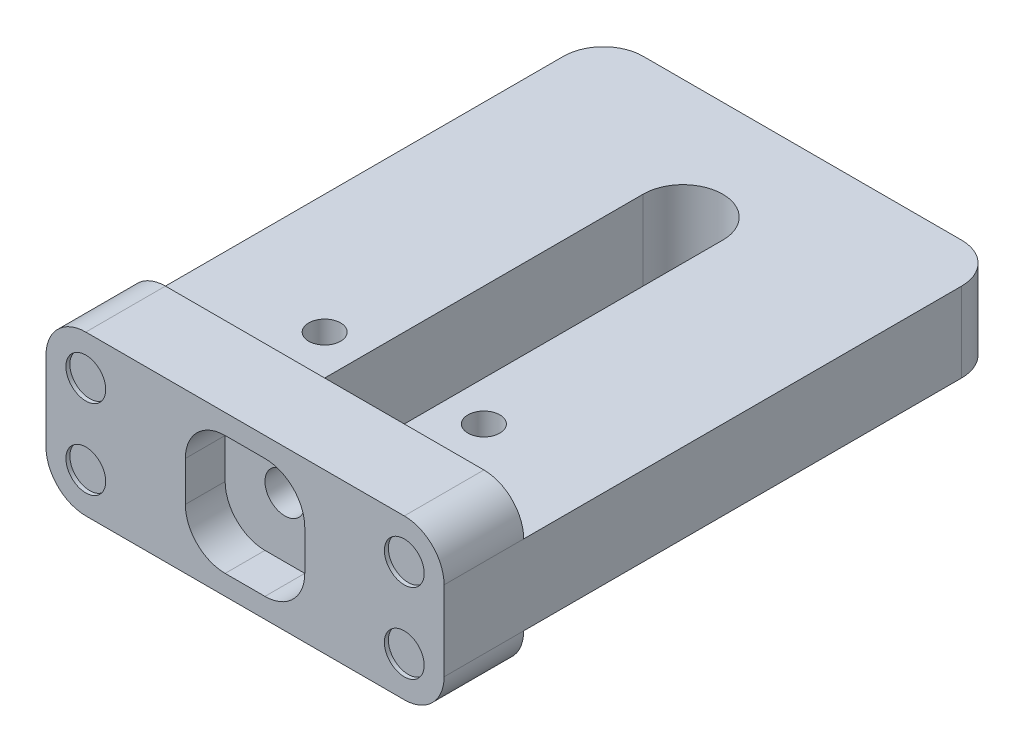
ISO-10303-21;
HEADER;
FILE_DESCRIPTION(('STEP AP214'),'2;1');
FILE_NAME('part.step','',(''),(''),'','','');
FILE_SCHEMA(('AUTOMOTIVE_DESIGN { 1 0 10303 214 1 1 1 1 }'));
ENDSEC;
DATA;
#1=APPLICATION_CONTEXT('core data for automotive mechanical design processes');
#2=APPLICATION_PROTOCOL_DEFINITION('international standard','automotive_design',2000,#1);
#3=PRODUCT_CONTEXT('',#1,'mechanical');
#4=PRODUCT('Part','Part','',(#3));
#5=PRODUCT_RELATED_PRODUCT_CATEGORY('part','',(#4));
#6=PRODUCT_DEFINITION_FORMATION('','',#4);
#7=PRODUCT_DEFINITION_CONTEXT('part definition',#1,'design');
#8=PRODUCT_DEFINITION('design','',#6,#7);
#9=PRODUCT_DEFINITION_SHAPE('','',#8);
#10=(LENGTH_UNIT() NAMED_UNIT(*) SI_UNIT(.MILLI.,.METRE.));
#11=(NAMED_UNIT(*) PLANE_ANGLE_UNIT() SI_UNIT($,.RADIAN.));
#12=(NAMED_UNIT(*) SI_UNIT($,.STERADIAN.) SOLID_ANGLE_UNIT());
#13=UNCERTAINTY_MEASURE_WITH_UNIT(LENGTH_MEASURE(1.E-05),#10,'distance_accuracy_value','');
#14=(GEOMETRIC_REPRESENTATION_CONTEXT(3) GLOBAL_UNCERTAINTY_ASSIGNED_CONTEXT((#13)) GLOBAL_UNIT_ASSIGNED_CONTEXT((#10,
#11,#12)) REPRESENTATION_CONTEXT('',''));
#15=CARTESIAN_POINT('',(0.,0.,0.));
#16=DIRECTION('',(0.,0.,1.));
#17=DIRECTION('',(1.,0.,0.));
#18=AXIS2_PLACEMENT_3D('',#15,#16,#17);
#19=CARTESIAN_POINT('',(0.,0.,-30.));
#20=DIRECTION('',(0.,1.,0.));
#21=DIRECTION('',(0.,0.,1.));
#22=AXIS2_PLACEMENT_3D('',#19,#20,#21);
#23=CYLINDRICAL_SURFACE('',#22,9.99999999999999);
#24=DIRECTION('',(0.,1.,0.));
#25=VECTOR('',#24,1.);
#26=CARTESIAN_POINT('',(-10.,-10.,-30.));
#27=LINE('',#26,#25);
#28=CARTESIAN_POINT('',(-10.,0.,-30.));
#29=VERTEX_POINT('',#28);
#30=CARTESIAN_POINT('',(-10.,20.,-29.9999999999999));
#31=VERTEX_POINT('',#30);
#32=EDGE_CURVE('E335',#29,#31,#27,.T.);
#33=ORIENTED_EDGE('',*,*,#32,.F.);
#34=CARTESIAN_POINT('',(0.,0.,-30.));
#35=DIRECTION('',(0.,-1.,0.));
#36=DIRECTION('',(0.,0.,-1.));
#37=AXIS2_PLACEMENT_3D('',#34,#35,#36);
#38=CIRCLE('',#37,9.99999999999999);
#39=CARTESIAN_POINT('',(10.,0.,-30.));
#40=VERTEX_POINT('',#39);
#41=EDGE_CURVE('E45',#29,#40,#38,.T.);
#42=ORIENTED_EDGE('',*,*,#41,.T.);
#43=DIRECTION('',(0.,1.,0.));
#44=VECTOR('',#43,1.);
#45=CARTESIAN_POINT('',(10.,-10.,-30.));
#46=LINE('',#45,#44);
#47=CARTESIAN_POINT('',(10.,20.,-29.9999999999999));
#48=VERTEX_POINT('',#47);
#49=EDGE_CURVE('E338',#48,#40,#46,.F.);
#50=ORIENTED_EDGE('',*,*,#49,.F.);
#51=CARTESIAN_POINT('',(0.,20.,-30.));
#52=DIRECTION('',(0.,-1.,0.));
#53=DIRECTION('',(0.,0.,-1.));
#54=AXIS2_PLACEMENT_3D('',#51,#52,#53);
#55=CIRCLE('',#54,9.99999999999999);
#56=EDGE_CURVE('E12',#48,#31,#55,.F.);
#57=ORIENTED_EDGE('',*,*,#56,.T.);
#58=EDGE_LOOP('',(#33,#42,#50,#57));
#59=FACE_BOUND('',#58,.T.);
#60=ADVANCED_FACE('F37',(#59),#23,.F.);
#61=CARTESIAN_POINT('',(0.,20.,0.));
#62=DIRECTION('',(0.,-1.,0.));
#63=DIRECTION('',(0.,0.,-1.));
#64=AXIS2_PLACEMENT_3D('',#61,#62,#63);
#65=PLANE('',#64);
#66=DIRECTION('',(0.,0.,-1.));
#67=VECTOR('',#66,1.);
#68=CARTESIAN_POINT('',(50.,20.,60.));
#69=LINE('',#68,#67);
#70=CARTESIAN_POINT('',(50.,20.,60.));
#71=VERTEX_POINT('',#70);
#72=CARTESIAN_POINT('',(50.,20.,-50.));
#73=VERTEX_POINT('',#72);
#74=EDGE_CURVE('E244',#71,#73,#69,.T.);
#75=ORIENTED_EDGE('',*,*,#74,.T.);
#76=CARTESIAN_POINT('',(40.,20.,-50.));
#77=DIRECTION('',(0.,-1.,0.));
#78=DIRECTION('',(0.,0.,-1.));
#79=AXIS2_PLACEMENT_3D('',#76,#77,#78);
#80=CIRCLE('',#79,10.);
#81=CARTESIAN_POINT('',(40.,20.,-60.));
#82=VERTEX_POINT('',#81);
#83=EDGE_CURVE('E295',#73,#82,#80,.F.);
#84=ORIENTED_EDGE('',*,*,#83,.T.);
#85=DIRECTION('',(-1.,0.,0.));
#86=VECTOR('',#85,1.);
#87=CARTESIAN_POINT('',(-50.,20.,-60.));
#88=LINE('',#87,#86);
#89=CARTESIAN_POINT('',(-40.,20.,-60.));
#90=VERTEX_POINT('',#89);
#91=EDGE_CURVE('E226',#82,#90,#88,.T.);
#92=ORIENTED_EDGE('',*,*,#91,.T.);
#93=CARTESIAN_POINT('',(-40.,20.,-50.));
#94=DIRECTION('',(0.,-1.,0.));
#95=DIRECTION('',(0.,0.,-1.));
#96=AXIS2_PLACEMENT_3D('',#93,#94,#95);
#97=CIRCLE('',#96,10.);
#98=CARTESIAN_POINT('',(-50.,20.,-50.));
#99=VERTEX_POINT('',#98);
#100=EDGE_CURVE('E293',#90,#99,#97,.F.);
#101=ORIENTED_EDGE('',*,*,#100,.T.);
#102=DIRECTION('',(0.,0.,1.));
#103=VECTOR('',#102,1.);
#104=CARTESIAN_POINT('',(-50.,20.,60.));
#105=LINE('',#104,#103);
#106=CARTESIAN_POINT('',(-50.,20.,60.));
#107=VERTEX_POINT('',#106);
#108=EDGE_CURVE('E221',#99,#107,#105,.T.);
#109=ORIENTED_EDGE('',*,*,#108,.T.);
#110=DIRECTION('',(1.,0.,0.));
#111=VECTOR('',#110,1.);
#112=CARTESIAN_POINT('',(-50.,20.,60.));
#113=LINE('',#112,#111);
#114=CARTESIAN_POINT('',(-10.,20.,60.));
#115=VERTEX_POINT('',#114);
#116=EDGE_CURVE('E220',#107,#115,#113,.T.);
#117=ORIENTED_EDGE('',*,*,#116,.T.);
#118=DIRECTION('',(0.,0.,1.));
#119=VECTOR('',#118,1.);
#120=CARTESIAN_POINT('',(-10.,20.,60.));
#121=LINE('',#120,#119);
#122=EDGE_CURVE('E214',#31,#115,#121,.T.);
#123=ORIENTED_EDGE('',*,*,#122,.F.);
#124=ORIENTED_EDGE('',*,*,#56,.F.);
#125=DIRECTION('',(0.,0.,-1.));
#126=VECTOR('',#125,1.);
#127=CARTESIAN_POINT('',(10.,20.,60.));
#128=LINE('',#127,#126);
#129=CARTESIAN_POINT('',(10.,20.,60.));
#130=VERTEX_POINT('',#129);
#131=EDGE_CURVE('E198',#130,#48,#128,.T.);
#132=ORIENTED_EDGE('',*,*,#131,.F.);
#133=EDGE_CURVE('E212',#130,#71,#113,.T.);
#134=ORIENTED_EDGE('',*,*,#133,.T.);
#135=EDGE_LOOP('',(#75,#84,#92,#101,#109,#117,#123,#124,#132,#134));
#136=FACE_BOUND('',#135,.T.);
#137=CARTESIAN_POINT('',(-20.,20.,40.));
#138=DIRECTION('',(0.,1.,0.));
#139=DIRECTION('',(0.,0.,1.));
#140=AXIS2_PLACEMENT_3D('',#137,#138,#139);
#141=CIRCLE('',#140,4.);
#142=CARTESIAN_POINT('',(-20.,20.,44.));
#143=VERTEX_POINT('',#142);
#144=EDGE_CURVE('E234',#143,#143,#141,.T.);
#145=ORIENTED_EDGE('',*,*,#144,.F.);
#146=EDGE_LOOP('',(#145));
#147=FACE_BOUND('',#146,.T.);
#148=CARTESIAN_POINT('',(20.,20.,40.));
#149=DIRECTION('',(0.,1.,0.));
#150=DIRECTION('',(0.,0.,1.));
#151=AXIS2_PLACEMENT_3D('',#148,#149,#150);
#152=CIRCLE('',#151,4.);
#153=CARTESIAN_POINT('',(20.,20.,44.));
#154=VERTEX_POINT('',#153);
#155=EDGE_CURVE('E421',#154,#154,#152,.T.);
#156=ORIENTED_EDGE('',*,*,#155,.F.);
#157=EDGE_LOOP('',(#156));
#158=FACE_BOUND('',#157,.T.);
#159=ADVANCED_FACE('F210',(#136,#147,#158),#65,.F.);
#160=CARTESIAN_POINT('',(0.,0.,0.));
#161=DIRECTION('',(0.,-1.,0.));
#162=DIRECTION('',(0.,0.,-1.));
#163=AXIS2_PLACEMENT_3D('',#160,#161,#162);
#164=PLANE('',#163);
#165=DIRECTION('',(-1.,0.,0.));
#166=VECTOR('',#165,1.);
#167=CARTESIAN_POINT('',(-50.,0.,-60.));
#168=LINE('',#167,#166);
#169=CARTESIAN_POINT('',(40.,0.,-60.));
#170=VERTEX_POINT('',#169);
#171=CARTESIAN_POINT('',(-40.,0.,-60.));
#172=VERTEX_POINT('',#171);
#173=EDGE_CURVE('E233',#170,#172,#168,.T.);
#174=ORIENTED_EDGE('',*,*,#173,.F.);
#175=CARTESIAN_POINT('',(40.,0.,-50.));
#176=DIRECTION('',(0.,-1.,0.));
#177=DIRECTION('',(0.,0.,-1.));
#178=AXIS2_PLACEMENT_3D('',#175,#176,#177);
#179=CIRCLE('',#178,10.);
#180=CARTESIAN_POINT('',(50.,0.,-50.));
#181=VERTEX_POINT('',#180);
#182=EDGE_CURVE('E289',#170,#181,#179,.T.);
#183=ORIENTED_EDGE('',*,*,#182,.T.);
#184=DIRECTION('',(0.,0.,-1.));
#185=VECTOR('',#184,1.);
#186=CARTESIAN_POINT('',(50.,0.,60.));
#187=LINE('',#186,#185);
#188=CARTESIAN_POINT('',(50.,0.,60.));
#189=VERTEX_POINT('',#188);
#190=EDGE_CURVE('E230',#189,#181,#187,.T.);
#191=ORIENTED_EDGE('',*,*,#190,.F.);
#192=DIRECTION('',(1.,0.,0.));
#193=VECTOR('',#192,1.);
#194=CARTESIAN_POINT('',(-50.,0.,60.));
#195=LINE('',#194,#193);
#196=CARTESIAN_POINT('',(10.,0.,60.));
#197=VERTEX_POINT('',#196);
#198=EDGE_CURVE('E240',#197,#189,#195,.T.);
#199=ORIENTED_EDGE('',*,*,#198,.F.);
#200=DIRECTION('',(0.,0.,1.));
#201=VECTOR('',#200,1.);
#202=CARTESIAN_POINT('',(10.,0.,0.));
#203=LINE('',#202,#201);
#204=EDGE_CURVE('E200',#40,#197,#203,.T.);
#205=ORIENTED_EDGE('',*,*,#204,.F.);
#206=ORIENTED_EDGE('',*,*,#41,.F.);
#207=DIRECTION('',(0.,0.,-1.));
#208=VECTOR('',#207,1.);
#209=CARTESIAN_POINT('',(-10.,0.,0.));
#210=LINE('',#209,#208);
#211=CARTESIAN_POINT('',(-10.,0.,60.));
#212=VERTEX_POINT('',#211);
#213=EDGE_CURVE('E345',#212,#29,#210,.T.);
#214=ORIENTED_EDGE('',*,*,#213,.F.);
#215=CARTESIAN_POINT('',(-50.,0.,60.));
#216=VERTEX_POINT('',#215);
#217=EDGE_CURVE('E241',#216,#212,#195,.T.);
#218=ORIENTED_EDGE('',*,*,#217,.F.);
#219=DIRECTION('',(0.,0.,1.));
#220=VECTOR('',#219,1.);
#221=CARTESIAN_POINT('',(-50.,0.,60.));
#222=LINE('',#221,#220);
#223=CARTESIAN_POINT('',(-50.,0.,-50.));
#224=VERTEX_POINT('',#223);
#225=EDGE_CURVE('E237',#224,#216,#222,.T.);
#226=ORIENTED_EDGE('',*,*,#225,.F.);
#227=CARTESIAN_POINT('',(-40.,0.,-50.));
#228=DIRECTION('',(0.,-1.,0.));
#229=DIRECTION('',(0.,0.,-1.));
#230=AXIS2_PLACEMENT_3D('',#227,#228,#229);
#231=CIRCLE('',#230,10.);
#232=EDGE_CURVE('E287',#224,#172,#231,.T.);
#233=ORIENTED_EDGE('',*,*,#232,.T.);
#234=EDGE_LOOP('',(#174,#183,#191,#199,#205,#206,#214,#218,#226,#233));
#235=FACE_BOUND('',#234,.T.);
#236=CARTESIAN_POINT('',(-20.,0.,40.));
#237=DIRECTION('',(0.,1.,0.));
#238=DIRECTION('',(0.,0.,1.));
#239=AXIS2_PLACEMENT_3D('',#236,#237,#238);
#240=CIRCLE('',#239,4.);
#241=CARTESIAN_POINT('',(-20.,0.,44.));
#242=VERTEX_POINT('',#241);
#243=EDGE_CURVE('E424',#242,#242,#240,.T.);
#244=ORIENTED_EDGE('',*,*,#243,.T.);
#245=EDGE_LOOP('',(#244));
#246=FACE_BOUND('',#245,.T.);
#247=CARTESIAN_POINT('',(20.,0.,40.));
#248=DIRECTION('',(0.,1.,0.));
#249=DIRECTION('',(0.,0.,1.));
#250=AXIS2_PLACEMENT_3D('',#247,#248,#249);
#251=CIRCLE('',#250,4.);
#252=CARTESIAN_POINT('',(20.,0.,44.));
#253=VERTEX_POINT('',#252);
#254=EDGE_CURVE('E416',#253,#253,#251,.T.);
#255=ORIENTED_EDGE('',*,*,#254,.T.);
#256=EDGE_LOOP('',(#255));
#257=FACE_BOUND('',#256,.T.);
#258=ADVANCED_FACE('F341',(#235,#246,#257),#164,.T.);
#259=CARTESIAN_POINT('',(50.,20.,60.));
#260=DIRECTION('',(-1.,0.,0.));
#261=DIRECTION('',(0.,0.,1.));
#262=AXIS2_PLACEMENT_3D('',#259,#260,#261);
#263=PLANE('',#262);
#264=ORIENTED_EDGE('',*,*,#74,.F.);
#265=DIRECTION('',(0.,0.,-1.));
#266=VECTOR('',#265,1.);
#267=CARTESIAN_POINT('',(50.,20.,60.));
#268=LINE('',#267,#266);
#269=CARTESIAN_POINT('',(50.,20.,80.));
#270=VERTEX_POINT('',#269);
#271=EDGE_CURVE('E315',#71,#270,#268,.F.);
#272=ORIENTED_EDGE('',*,*,#271,.T.);
#273=DIRECTION('',(0.,1.,0.));
#274=VECTOR('',#273,1.);
#275=CARTESIAN_POINT('',(50.,-10.,80.));
#276=LINE('',#275,#274);
#277=CARTESIAN_POINT('',(50.,0.,80.));
#278=VERTEX_POINT('',#277);
#279=EDGE_CURVE('E410',#278,#270,#276,.T.);
#280=ORIENTED_EDGE('',*,*,#279,.F.);
#281=DIRECTION('',(0.,0.,-1.));
#282=VECTOR('',#281,1.);
#283=CARTESIAN_POINT('',(50.,0.,60.));
#284=LINE('',#283,#282);
#285=EDGE_CURVE('E312',#278,#189,#284,.T.);
#286=ORIENTED_EDGE('',*,*,#285,.T.);
#287=ORIENTED_EDGE('',*,*,#190,.T.);
#288=DIRECTION('',(0.,-1.,0.));
#289=VECTOR('',#288,1.);
#290=CARTESIAN_POINT('',(50.,20.,-50.));
#291=LINE('',#290,#289);
#292=EDGE_CURVE('E291',#181,#73,#291,.F.);
#293=ORIENTED_EDGE('',*,*,#292,.T.);
#294=EDGE_LOOP('',(#264,#272,#280,#286,#287,#293));
#295=FACE_BOUND('',#294,.T.);
#296=ADVANCED_FACE('F474',(#295),#263,.F.);
#297=CARTESIAN_POINT('',(-50.,20.,-60.));
#298=DIRECTION('',(0.,0.,1.));
#299=DIRECTION('',(1.,0.,0.));
#300=AXIS2_PLACEMENT_3D('',#297,#298,#299);
#301=PLANE('',#300);
#302=ORIENTED_EDGE('',*,*,#91,.F.);
#303=DIRECTION('',(0.,-1.,0.));
#304=VECTOR('',#303,1.);
#305=CARTESIAN_POINT('',(40.,20.,-60.));
#306=LINE('',#305,#304);
#307=EDGE_CURVE('E284',#82,#170,#306,.T.);
#308=ORIENTED_EDGE('',*,*,#307,.T.);
#309=ORIENTED_EDGE('',*,*,#173,.T.);
#310=DIRECTION('',(0.,-1.,0.));
#311=VECTOR('',#310,1.);
#312=CARTESIAN_POINT('',(-40.,20.,-60.));
#313=LINE('',#312,#311);
#314=EDGE_CURVE('E282',#172,#90,#313,.F.);
#315=ORIENTED_EDGE('',*,*,#314,.T.);
#316=EDGE_LOOP('',(#302,#308,#309,#315));
#317=FACE_BOUND('',#316,.T.);
#318=ADVANCED_FACE('F482',(#317),#301,.F.);
#319=CARTESIAN_POINT('',(-50.,20.,60.));
#320=DIRECTION('',(1.,0.,0.));
#321=DIRECTION('',(0.,0.,-1.));
#322=AXIS2_PLACEMENT_3D('',#319,#320,#321);
#323=PLANE('',#322);
#324=ORIENTED_EDGE('',*,*,#225,.T.);
#325=DIRECTION('',(0.,0.,-1.));
#326=VECTOR('',#325,1.);
#327=CARTESIAN_POINT('',(-50.,0.,60.));
#328=LINE('',#327,#326);
#329=CARTESIAN_POINT('',(-50.,0.,80.));
#330=VERTEX_POINT('',#329);
#331=EDGE_CURVE('E333',#216,#330,#328,.F.);
#332=ORIENTED_EDGE('',*,*,#331,.T.);
#333=DIRECTION('',(0.,-1.,0.));
#334=VECTOR('',#333,1.);
#335=CARTESIAN_POINT('',(-50.,-10.,80.));
#336=LINE('',#335,#334);
#337=CARTESIAN_POINT('',(-50.,20.,80.));
#338=VERTEX_POINT('',#337);
#339=EDGE_CURVE('E403',#338,#330,#336,.T.);
#340=ORIENTED_EDGE('',*,*,#339,.F.);
#341=DIRECTION('',(0.,0.,-1.));
#342=VECTOR('',#341,1.);
#343=CARTESIAN_POINT('',(-50.,20.,60.));
#344=LINE('',#343,#342);
#345=EDGE_CURVE('E330',#338,#107,#344,.T.);
#346=ORIENTED_EDGE('',*,*,#345,.T.);
#347=ORIENTED_EDGE('',*,*,#108,.F.);
#348=DIRECTION('',(0.,-1.,0.));
#349=VECTOR('',#348,1.);
#350=CARTESIAN_POINT('',(-50.,20.,-50.));
#351=LINE('',#350,#349);
#352=EDGE_CURVE('E297',#99,#224,#351,.T.);
#353=ORIENTED_EDGE('',*,*,#352,.T.);
#354=EDGE_LOOP('',(#324,#332,#340,#346,#347,#353));
#355=FACE_BOUND('',#354,.T.);
#356=ADVANCED_FACE('F444',(#355),#323,.F.);
#357=CARTESIAN_POINT('',(-20.,20.,40.));
#358=DIRECTION('',(0.,-1.,0.));
#359=DIRECTION('',(0.,0.,-1.));
#360=AXIS2_PLACEMENT_3D('',#357,#358,#359);
#361=CYLINDRICAL_SURFACE('',#360,4.);
#362=ORIENTED_EDGE('',*,*,#144,.T.);
#363=EDGE_LOOP('',(#362));
#364=FACE_BOUND('',#363,.T.);
#365=ORIENTED_EDGE('',*,*,#243,.F.);
#366=EDGE_LOOP('',(#365));
#367=FACE_BOUND('',#366,.T.);
#368=ADVANCED_FACE('F477',(#364,#367),#361,.F.);
#369=CARTESIAN_POINT('',(20.,20.,40.));
#370=DIRECTION('',(0.,-1.,0.));
#371=DIRECTION('',(0.,0.,-1.));
#372=AXIS2_PLACEMENT_3D('',#369,#370,#371);
#373=CYLINDRICAL_SURFACE('',#372,4.);
#374=ORIENTED_EDGE('',*,*,#155,.T.);
#375=EDGE_LOOP('',(#374));
#376=FACE_BOUND('',#375,.T.);
#377=ORIENTED_EDGE('',*,*,#254,.F.);
#378=EDGE_LOOP('',(#377));
#379=FACE_BOUND('',#378,.T.);
#380=ADVANCED_FACE('F715',(#376,#379),#373,.F.);
#381=CARTESIAN_POINT('',(0.,0.,60.));
#382=DIRECTION('',(0.,0.,-1.));
#383=DIRECTION('',(-1.,0.,0.));
#384=AXIS2_PLACEMENT_3D('',#381,#382,#383);
#385=PLANE('',#384);
#386=DIRECTION('',(-1.,0.,0.));
#387=VECTOR('',#386,1.);
#388=CARTESIAN_POINT('',(-50.,30.,60.));
#389=LINE('',#388,#387);
#390=CARTESIAN_POINT('',(40.,30.,60.));
#391=VERTEX_POINT('',#390);
#392=CARTESIAN_POINT('',(-40.,30.,60.));
#393=VERTEX_POINT('',#392);
#394=EDGE_CURVE('E407',#391,#393,#389,.T.);
#395=ORIENTED_EDGE('',*,*,#394,.F.);
#396=CARTESIAN_POINT('',(40.,20.,60.));
#397=DIRECTION('',(0.,0.,-1.));
#398=DIRECTION('',(-1.,0.,0.));
#399=AXIS2_PLACEMENT_3D('',#396,#397,#398);
#400=CIRCLE('',#399,10.);
#401=EDGE_CURVE('E219',#391,#71,#400,.T.);
#402=ORIENTED_EDGE('',*,*,#401,.T.);
#403=ORIENTED_EDGE('',*,*,#133,.F.);
#404=DIRECTION('',(0.,1.,0.));
#405=VECTOR('',#404,1.);
#406=CARTESIAN_POINT('',(10.,-10.,60.));
#407=LINE('',#406,#405);
#408=EDGE_CURVE('E196',#197,#130,#407,.T.);
#409=ORIENTED_EDGE('',*,*,#408,.F.);
#410=ORIENTED_EDGE('',*,*,#198,.T.);
#411=CARTESIAN_POINT('',(40.,0.,60.));
#412=DIRECTION('',(0.,0.,-1.));
#413=DIRECTION('',(-1.,0.,0.));
#414=AXIS2_PLACEMENT_3D('',#411,#412,#413);
#415=CIRCLE('',#414,10.);
#416=CARTESIAN_POINT('',(40.,-10.,60.));
#417=VERTEX_POINT('',#416);
#418=EDGE_CURVE('E309',#189,#417,#415,.T.);
#419=ORIENTED_EDGE('',*,*,#418,.T.);
#420=DIRECTION('',(1.,0.,0.));
#421=VECTOR('',#420,1.);
#422=CARTESIAN_POINT('',(-50.,-10.,60.));
#423=LINE('',#422,#421);
#424=CARTESIAN_POINT('',(-40.,-10.,60.));
#425=VERTEX_POINT('',#424);
#426=EDGE_CURVE('E392',#425,#417,#423,.T.);
#427=ORIENTED_EDGE('',*,*,#426,.F.);
#428=CARTESIAN_POINT('',(-40.,0.,60.));
#429=DIRECTION('',(0.,0.,-1.));
#430=DIRECTION('',(-1.,0.,0.));
#431=AXIS2_PLACEMENT_3D('',#428,#429,#430);
#432=CIRCLE('',#431,10.);
#433=EDGE_CURVE('E307',#425,#216,#432,.T.);
#434=ORIENTED_EDGE('',*,*,#433,.T.);
#435=ORIENTED_EDGE('',*,*,#217,.T.);
#436=DIRECTION('',(0.,1.,0.));
#437=VECTOR('',#436,1.);
#438=CARTESIAN_POINT('',(-10.,-10.,60.));
#439=LINE('',#438,#437);
#440=EDGE_CURVE('E206',#212,#115,#439,.T.);
#441=ORIENTED_EDGE('',*,*,#440,.T.);
#442=ORIENTED_EDGE('',*,*,#116,.F.);
#443=CARTESIAN_POINT('',(-40.,20.,60.));
#444=DIRECTION('',(0.,0.,-1.));
#445=DIRECTION('',(-1.,0.,0.));
#446=AXIS2_PLACEMENT_3D('',#443,#444,#445);
#447=CIRCLE('',#446,10.);
#448=EDGE_CURVE('E305',#107,#393,#447,.T.);
#449=ORIENTED_EDGE('',*,*,#448,.T.);
#450=EDGE_LOOP('',(#395,#402,#403,#409,#410,#419,#427,#434,#435,#441,#442,#449));
#451=FACE_BOUND('',#450,.T.);
#452=CARTESIAN_POINT('',(0.,9.99999999999998,60.));
#453=DIRECTION('',(0.,0.,1.));
#454=DIRECTION('',(1.,0.,0.));
#455=AXIS2_PLACEMENT_3D('',#452,#453,#454);
#456=CIRCLE('',#455,5.);
#457=CARTESIAN_POINT('',(5.,9.99999999999998,60.));
#458=VERTEX_POINT('',#457);
#459=EDGE_CURVE('E205',#458,#458,#456,.F.);
#460=ORIENTED_EDGE('',*,*,#459,.F.);
#461=EDGE_LOOP('',(#460));
#462=FACE_BOUND('',#461,.T.);
#463=ADVANCED_FACE('F217',(#451,#462),#385,.T.);
#464=CARTESIAN_POINT('',(-50.,-10.,80.));
#465=DIRECTION('',(0.,1.,0.));
#466=DIRECTION('',(0.,0.,1.));
#467=AXIS2_PLACEMENT_3D('',#464,#465,#466);
#468=PLANE('',#467);
#469=ORIENTED_EDGE('',*,*,#426,.T.);
#470=DIRECTION('',(0.,0.,-1.));
#471=VECTOR('',#470,1.);
#472=CARTESIAN_POINT('',(40.,-10.,80.0000000000001));
#473=LINE('',#472,#471);
#474=CARTESIAN_POINT('',(40.,-10.,80.));
#475=VERTEX_POINT('',#474);
#476=EDGE_CURVE('E328',#417,#475,#473,.F.);
#477=ORIENTED_EDGE('',*,*,#476,.T.);
#478=DIRECTION('',(1.,0.,0.));
#479=VECTOR('',#478,1.);
#480=CARTESIAN_POINT('',(-50.,-10.,80.));
#481=LINE('',#480,#479);
#482=CARTESIAN_POINT('',(-40.,-10.,80.));
#483=VERTEX_POINT('',#482);
#484=EDGE_CURVE('E406',#483,#475,#481,.T.);
#485=ORIENTED_EDGE('',*,*,#484,.F.);
#486=DIRECTION('',(0.,0.,-1.));
#487=VECTOR('',#486,1.);
#488=CARTESIAN_POINT('',(-40.,-10.,80.));
#489=LINE('',#488,#487);
#490=EDGE_CURVE('E325',#483,#425,#489,.T.);
#491=ORIENTED_EDGE('',*,*,#490,.T.);
#492=EDGE_LOOP('',(#469,#477,#485,#491));
#493=FACE_BOUND('',#492,.T.);
#494=ADVANCED_FACE('F700',(#493),#468,.F.);
#495=CARTESIAN_POINT('',(-50.,30.,80.));
#496=DIRECTION('',(0.,-1.,0.));
#497=DIRECTION('',(1.,0.,0.));
#498=AXIS2_PLACEMENT_3D('',#495,#496,#497);
#499=PLANE('',#498);
#500=DIRECTION('',(-1.,0.,0.));
#501=VECTOR('',#500,1.);
#502=CARTESIAN_POINT('',(-50.,30.,80.));
#503=LINE('',#502,#501);
#504=CARTESIAN_POINT('',(39.9999999999999,30.,80.));
#505=VERTEX_POINT('',#504);
#506=CARTESIAN_POINT('',(-40.,30.,80.));
#507=VERTEX_POINT('',#506);
#508=EDGE_CURVE('E413',#505,#507,#503,.T.);
#509=ORIENTED_EDGE('',*,*,#508,.F.);
#510=DIRECTION('',(0.,0.,-1.));
#511=VECTOR('',#510,1.);
#512=CARTESIAN_POINT('',(39.9999999999999,30.,80.0000000000001));
#513=LINE('',#512,#511);
#514=EDGE_CURVE('E302',#505,#391,#513,.T.);
#515=ORIENTED_EDGE('',*,*,#514,.T.);
#516=ORIENTED_EDGE('',*,*,#394,.T.);
#517=DIRECTION('',(0.,0.,-1.));
#518=VECTOR('',#517,1.);
#519=CARTESIAN_POINT('',(-40.,30.,80.));
#520=LINE('',#519,#518);
#521=EDGE_CURVE('E300',#393,#507,#520,.F.);
#522=ORIENTED_EDGE('',*,*,#521,.T.);
#523=EDGE_LOOP('',(#509,#515,#516,#522));
#524=FACE_BOUND('',#523,.T.);
#525=ADVANCED_FACE('F692',(#524),#499,.F.);
#526=CARTESIAN_POINT('',(0.,0.,80.));
#527=DIRECTION('',(0.,0.,-1.));
#528=DIRECTION('',(-1.,0.,0.));
#529=AXIS2_PLACEMENT_3D('',#526,#527,#528);
#530=PLANE('',#529);
#531=CARTESIAN_POINT('',(-40.,0.,80.));
#532=DIRECTION('',(0.,0.,1.));
#533=DIRECTION('',(-1.,0.,0.));
#534=AXIS2_PLACEMENT_3D('',#531,#532,#533);
#535=CIRCLE('',#534,4.99999999999999);
#536=CARTESIAN_POINT('',(-45.,0.,80.));
#537=VERTEX_POINT('',#536);
#538=EDGE_CURVE('E348',#537,#537,#535,.T.);
#539=ORIENTED_EDGE('',*,*,#538,.F.);
#540=EDGE_LOOP('',(#539));
#541=FACE_BOUND('',#540,.T.);
#542=CARTESIAN_POINT('',(39.9999999999999,0.,80.));
#543=DIRECTION('',(0.,0.,1.));
#544=DIRECTION('',(1.,0.,0.));
#545=AXIS2_PLACEMENT_3D('',#542,#543,#544);
#546=CIRCLE('',#545,5.00000000000001);
#547=CARTESIAN_POINT('',(45.,0.,80.));
#548=VERTEX_POINT('',#547);
#549=EDGE_CURVE('E362',#548,#548,#546,.T.);
#550=ORIENTED_EDGE('',*,*,#549,.F.);
#551=EDGE_LOOP('',(#550));
#552=FACE_BOUND('',#551,.T.);
#553=CARTESIAN_POINT('',(39.9999999999999,20.,80.));
#554=DIRECTION('',(0.,0.,1.));
#555=DIRECTION('',(-1.,0.,0.));
#556=AXIS2_PLACEMENT_3D('',#553,#554,#555);
#557=CIRCLE('',#556,5.00000000000001);
#558=CARTESIAN_POINT('',(34.9999999999999,20.,80.));
#559=VERTEX_POINT('',#558);
#560=EDGE_CURVE('E356',#559,#559,#557,.T.);
#561=ORIENTED_EDGE('',*,*,#560,.F.);
#562=EDGE_LOOP('',(#561));
#563=FACE_BOUND('',#562,.T.);
#564=CARTESIAN_POINT('',(-40.,20.,80.));
#565=DIRECTION('',(0.,0.,1.));
#566=DIRECTION('',(1.,0.,0.));
#567=AXIS2_PLACEMENT_3D('',#564,#565,#566);
#568=CIRCLE('',#567,5.);
#569=CARTESIAN_POINT('',(-35.,20.,80.));
#570=VERTEX_POINT('',#569);
#571=EDGE_CURVE('E355',#570,#570,#568,.T.);
#572=ORIENTED_EDGE('',*,*,#571,.F.);
#573=EDGE_LOOP('',(#572));
#574=FACE_BOUND('',#573,.T.);
#575=DIRECTION('',(-1.,0.,0.));
#576=VECTOR('',#575,1.);
#577=CARTESIAN_POINT('',(-15.,25.,80.));
#578=LINE('',#577,#576);
#579=CARTESIAN_POINT('',(5.,25.,80.));
#580=VERTEX_POINT('',#579);
#581=CARTESIAN_POINT('',(-5.,25.,80.));
#582=VERTEX_POINT('',#581);
#583=EDGE_CURVE('E395',#580,#582,#578,.T.);
#584=ORIENTED_EDGE('',*,*,#583,.F.);
#585=CARTESIAN_POINT('',(5.,15.,80.));
#586=DIRECTION('',(0.,0.,-1.));
#587=DIRECTION('',(-1.,0.,0.));
#588=AXIS2_PLACEMENT_3D('',#585,#586,#587);
#589=CIRCLE('',#588,10.);
#590=CARTESIAN_POINT('',(15.,15.,80.));
#591=VERTEX_POINT('',#590);
#592=EDGE_CURVE('E274',#580,#591,#589,.T.);
#593=ORIENTED_EDGE('',*,*,#592,.T.);
#594=DIRECTION('',(0.,1.,0.));
#595=VECTOR('',#594,1.);
#596=CARTESIAN_POINT('',(15.,-5.00000000000002,80.));
#597=LINE('',#596,#595);
#598=CARTESIAN_POINT('',(15.,4.99999999999998,80.));
#599=VERTEX_POINT('',#598);
#600=EDGE_CURVE('E378',#599,#591,#597,.T.);
#601=ORIENTED_EDGE('',*,*,#600,.F.);
#602=CARTESIAN_POINT('',(5.,4.99999999999998,80.));
#603=DIRECTION('',(0.,0.,-1.));
#604=DIRECTION('',(-1.,0.,0.));
#605=AXIS2_PLACEMENT_3D('',#602,#603,#604);
#606=CIRCLE('',#605,10.);
#607=CARTESIAN_POINT('',(5.,-5.00000000000002,80.));
#608=VERTEX_POINT('',#607);
#609=EDGE_CURVE('E276',#599,#608,#606,.T.);
#610=ORIENTED_EDGE('',*,*,#609,.T.);
#611=DIRECTION('',(1.,0.,0.));
#612=VECTOR('',#611,1.);
#613=CARTESIAN_POINT('',(-15.,-5.00000000000002,80.));
#614=LINE('',#613,#612);
#615=CARTESIAN_POINT('',(-5.,-5.00000000000002,80.));
#616=VERTEX_POINT('',#615);
#617=EDGE_CURVE('E383',#616,#608,#614,.T.);
#618=ORIENTED_EDGE('',*,*,#617,.F.);
#619=CARTESIAN_POINT('',(-5.,4.99999999999998,80.));
#620=DIRECTION('',(0.,0.,-1.));
#621=DIRECTION('',(-1.,0.,0.));
#622=AXIS2_PLACEMENT_3D('',#619,#620,#621);
#623=CIRCLE('',#622,10.);
#624=CARTESIAN_POINT('',(-15.,4.99999999999998,80.));
#625=VERTEX_POINT('',#624);
#626=EDGE_CURVE('E278',#616,#625,#623,.T.);
#627=ORIENTED_EDGE('',*,*,#626,.T.);
#628=DIRECTION('',(0.,-1.,0.));
#629=VECTOR('',#628,1.);
#630=CARTESIAN_POINT('',(-15.,-5.00000000000002,80.));
#631=LINE('',#630,#629);
#632=CARTESIAN_POINT('',(-15.,15.,80.));
#633=VERTEX_POINT('',#632);
#634=EDGE_CURVE('E398',#633,#625,#631,.T.);
#635=ORIENTED_EDGE('',*,*,#634,.F.);
#636=CARTESIAN_POINT('',(-5.,15.,80.));
#637=DIRECTION('',(0.,0.,-1.));
#638=DIRECTION('',(-1.,0.,0.));
#639=AXIS2_PLACEMENT_3D('',#636,#637,#638);
#640=CIRCLE('',#639,10.);
#641=EDGE_CURVE('E280',#633,#582,#640,.T.);
#642=ORIENTED_EDGE('',*,*,#641,.T.);
#643=EDGE_LOOP('',(#584,#593,#601,#610,#618,#627,#635,#642));
#644=FACE_BOUND('',#643,.T.);
#645=ORIENTED_EDGE('',*,*,#279,.T.);
#646=CARTESIAN_POINT('',(40.,20.,80.));
#647=DIRECTION('',(0.,0.,-1.));
#648=DIRECTION('',(-1.,0.,0.));
#649=AXIS2_PLACEMENT_3D('',#646,#647,#648);
#650=CIRCLE('',#649,10.);
#651=EDGE_CURVE('E323',#270,#505,#650,.F.);
#652=ORIENTED_EDGE('',*,*,#651,.T.);
#653=ORIENTED_EDGE('',*,*,#508,.T.);
#654=CARTESIAN_POINT('',(-40.,20.,80.));
#655=DIRECTION('',(0.,0.,-1.));
#656=DIRECTION('',(-1.,0.,0.));
#657=AXIS2_PLACEMENT_3D('',#654,#655,#656);
#658=CIRCLE('',#657,10.);
#659=EDGE_CURVE('E317',#507,#338,#658,.F.);
#660=ORIENTED_EDGE('',*,*,#659,.T.);
#661=ORIENTED_EDGE('',*,*,#339,.T.);
#662=CARTESIAN_POINT('',(-40.,0.,80.));
#663=DIRECTION('',(0.,0.,-1.));
#664=DIRECTION('',(-1.,0.,0.));
#665=AXIS2_PLACEMENT_3D('',#662,#663,#664);
#666=CIRCLE('',#665,10.);
#667=EDGE_CURVE('E319',#330,#483,#666,.F.);
#668=ORIENTED_EDGE('',*,*,#667,.T.);
#669=ORIENTED_EDGE('',*,*,#484,.T.);
#670=CARTESIAN_POINT('',(40.,0.,80.));
#671=DIRECTION('',(0.,0.,-1.));
#672=DIRECTION('',(-1.,0.,0.));
#673=AXIS2_PLACEMENT_3D('',#670,#671,#672);
#674=CIRCLE('',#673,10.);
#675=EDGE_CURVE('E321',#475,#278,#674,.F.);
#676=ORIENTED_EDGE('',*,*,#675,.T.);
#677=EDGE_LOOP('',(#645,#652,#653,#660,#661,#668,#669,#676));
#678=FACE_BOUND('',#677,.T.);
#679=ADVANCED_FACE('F455',(#541,#552,#563,#574,#644,#678),#530,.F.);
#680=CARTESIAN_POINT('',(15.,-5.00000000000002,70.));
#681=DIRECTION('',(1.,0.,0.));
#682=DIRECTION('',(0.,0.,-1.));
#683=AXIS2_PLACEMENT_3D('',#680,#681,#682);
#684=PLANE('',#683);
#685=ORIENTED_EDGE('',*,*,#600,.T.);
#686=DIRECTION('',(0.,0.,1.));
#687=VECTOR('',#686,1.);
#688=CARTESIAN_POINT('',(15.,15.,70.));
#689=LINE('',#688,#687);
#690=CARTESIAN_POINT('',(15.,15.,70.));
#691=VERTEX_POINT('',#690);
#692=EDGE_CURVE('E254',#591,#691,#689,.F.);
#693=ORIENTED_EDGE('',*,*,#692,.T.);
#694=DIRECTION('',(0.,1.,0.));
#695=VECTOR('',#694,1.);
#696=CARTESIAN_POINT('',(15.,-5.00000000000002,70.));
#697=LINE('',#696,#695);
#698=CARTESIAN_POINT('',(15.,4.99999999999998,70.));
#699=VERTEX_POINT('',#698);
#700=EDGE_CURVE('E379',#699,#691,#697,.T.);
#701=ORIENTED_EDGE('',*,*,#700,.F.);
#702=DIRECTION('',(0.,0.,1.));
#703=VECTOR('',#702,1.);
#704=CARTESIAN_POINT('',(15.,4.99999999999998,80.));
#705=LINE('',#704,#703);
#706=EDGE_CURVE('E251',#699,#599,#705,.T.);
#707=ORIENTED_EDGE('',*,*,#706,.T.);
#708=EDGE_LOOP('',(#685,#693,#701,#707));
#709=FACE_BOUND('',#708,.T.);
#710=ADVANCED_FACE('F679',(#709),#684,.F.);
#711=CARTESIAN_POINT('',(-15.,-5.00000000000002,70.));
#712=DIRECTION('',(0.,-1.,0.));
#713=DIRECTION('',(0.,0.,-1.));
#714=AXIS2_PLACEMENT_3D('',#711,#712,#713);
#715=PLANE('',#714);
#716=ORIENTED_EDGE('',*,*,#617,.T.);
#717=DIRECTION('',(0.,0.,1.));
#718=VECTOR('',#717,1.);
#719=CARTESIAN_POINT('',(5.,-5.00000000000002,70.));
#720=LINE('',#719,#718);
#721=CARTESIAN_POINT('',(5.,-5.00000000000002,70.));
#722=VERTEX_POINT('',#721);
#723=EDGE_CURVE('E267',#608,#722,#720,.F.);
#724=ORIENTED_EDGE('',*,*,#723,.T.);
#725=DIRECTION('',(1.,0.,0.));
#726=VECTOR('',#725,1.);
#727=CARTESIAN_POINT('',(-15.,-5.00000000000002,70.));
#728=LINE('',#727,#726);
#729=CARTESIAN_POINT('',(-5.,-5.00000000000002,70.));
#730=VERTEX_POINT('',#729);
#731=EDGE_CURVE('E389',#730,#722,#728,.T.);
#732=ORIENTED_EDGE('',*,*,#731,.F.);
#733=DIRECTION('',(0.,0.,1.));
#734=VECTOR('',#733,1.);
#735=CARTESIAN_POINT('',(-5.,-5.00000000000002,80.));
#736=LINE('',#735,#734);
#737=EDGE_CURVE('E264',#730,#616,#736,.T.);
#738=ORIENTED_EDGE('',*,*,#737,.T.);
#739=EDGE_LOOP('',(#716,#724,#732,#738));
#740=FACE_BOUND('',#739,.T.);
#741=ADVANCED_FACE('F671',(#740),#715,.F.);
#742=CARTESIAN_POINT('',(-15.,-5.00000000000002,70.));
#743=DIRECTION('',(-1.,0.,0.));
#744=DIRECTION('',(0.,0.,1.));
#745=AXIS2_PLACEMENT_3D('',#742,#743,#744);
#746=PLANE('',#745);
#747=ORIENTED_EDGE('',*,*,#634,.T.);
#748=DIRECTION('',(0.,0.,1.));
#749=VECTOR('',#748,1.);
#750=CARTESIAN_POINT('',(-15.,4.99999999999998,70.));
#751=LINE('',#750,#749);
#752=CARTESIAN_POINT('',(-15.,4.99999999999998,70.));
#753=VERTEX_POINT('',#752);
#754=EDGE_CURVE('E272',#625,#753,#751,.F.);
#755=ORIENTED_EDGE('',*,*,#754,.T.);
#756=DIRECTION('',(0.,-1.,0.));
#757=VECTOR('',#756,1.);
#758=CARTESIAN_POINT('',(-15.,-5.00000000000002,70.));
#759=LINE('',#758,#757);
#760=CARTESIAN_POINT('',(-15.,15.,70.));
#761=VERTEX_POINT('',#760);
#762=EDGE_CURVE('E386',#761,#753,#759,.T.);
#763=ORIENTED_EDGE('',*,*,#762,.F.);
#764=DIRECTION('',(0.,0.,1.));
#765=VECTOR('',#764,1.);
#766=CARTESIAN_POINT('',(-15.,15.,80.));
#767=LINE('',#766,#765);
#768=EDGE_CURVE('E269',#761,#633,#767,.T.);
#769=ORIENTED_EDGE('',*,*,#768,.T.);
#770=EDGE_LOOP('',(#747,#755,#763,#769));
#771=FACE_BOUND('',#770,.T.);
#772=ADVANCED_FACE('F663',(#771),#746,.F.);
#773=CARTESIAN_POINT('',(-15.,25.,70.));
#774=DIRECTION('',(0.,1.,0.));
#775=DIRECTION('',(0.,0.,1.));
#776=AXIS2_PLACEMENT_3D('',#773,#774,#775);
#777=PLANE('',#776);
#778=DIRECTION('',(-1.,0.,0.));
#779=VECTOR('',#778,1.);
#780=CARTESIAN_POINT('',(-15.,25.,70.));
#781=LINE('',#780,#779);
#782=CARTESIAN_POINT('',(5.,25.,70.));
#783=VERTEX_POINT('',#782);
#784=CARTESIAN_POINT('',(-5.,25.,70.));
#785=VERTEX_POINT('',#784);
#786=EDGE_CURVE('E382',#783,#785,#781,.T.);
#787=ORIENTED_EDGE('',*,*,#786,.F.);
#788=DIRECTION('',(0.,0.,1.));
#789=VECTOR('',#788,1.);
#790=CARTESIAN_POINT('',(5.,25.,80.));
#791=LINE('',#790,#789);
#792=EDGE_CURVE('E248',#783,#580,#791,.T.);
#793=ORIENTED_EDGE('',*,*,#792,.T.);
#794=ORIENTED_EDGE('',*,*,#583,.T.);
#795=DIRECTION('',(0.,0.,1.));
#796=VECTOR('',#795,1.);
#797=CARTESIAN_POINT('',(-5.,25.,70.));
#798=LINE('',#797,#796);
#799=EDGE_CURVE('E224',#582,#785,#798,.F.);
#800=ORIENTED_EDGE('',*,*,#799,.T.);
#801=EDGE_LOOP('',(#787,#793,#794,#800));
#802=FACE_BOUND('',#801,.T.);
#803=ADVANCED_FACE('F655',(#802),#777,.F.);
#804=CARTESIAN_POINT('',(0.,0.,70.));
#805=DIRECTION('',(0.,0.,-1.));
#806=DIRECTION('',(-1.,0.,0.));
#807=AXIS2_PLACEMENT_3D('',#804,#805,#806);
#808=PLANE('',#807);
#809=CARTESIAN_POINT('',(0.,9.99999999999998,70.));
#810=DIRECTION('',(0.,0.,1.));
#811=DIRECTION('',(1.,0.,0.));
#812=AXIS2_PLACEMENT_3D('',#809,#810,#811);
#813=CIRCLE('',#812,5.);
#814=CARTESIAN_POINT('',(5.,9.99999999999998,70.));
#815=VERTEX_POINT('',#814);
#816=EDGE_CURVE('E373',#815,#815,#813,.T.);
#817=ORIENTED_EDGE('',*,*,#816,.F.);
#818=EDGE_LOOP('',(#817));
#819=FACE_BOUND('',#818,.T.);
#820=ORIENTED_EDGE('',*,*,#700,.T.);
#821=CARTESIAN_POINT('',(5.,15.,70.));
#822=DIRECTION('',(0.,0.,-1.));
#823=DIRECTION('',(-1.,0.,0.));
#824=AXIS2_PLACEMENT_3D('',#821,#822,#823);
#825=CIRCLE('',#824,10.);
#826=EDGE_CURVE('E262',#691,#783,#825,.F.);
#827=ORIENTED_EDGE('',*,*,#826,.T.);
#828=ORIENTED_EDGE('',*,*,#786,.T.);
#829=CARTESIAN_POINT('',(-5.,15.,70.));
#830=DIRECTION('',(0.,0.,-1.));
#831=DIRECTION('',(-1.,0.,0.));
#832=AXIS2_PLACEMENT_3D('',#829,#830,#831);
#833=CIRCLE('',#832,10.);
#834=EDGE_CURVE('E256',#785,#761,#833,.F.);
#835=ORIENTED_EDGE('',*,*,#834,.T.);
#836=ORIENTED_EDGE('',*,*,#762,.T.);
#837=CARTESIAN_POINT('',(-5.,4.99999999999998,70.));
#838=DIRECTION('',(0.,0.,-1.));
#839=DIRECTION('',(-1.,0.,0.));
#840=AXIS2_PLACEMENT_3D('',#837,#838,#839);
#841=CIRCLE('',#840,10.);
#842=EDGE_CURVE('E258',#753,#730,#841,.F.);
#843=ORIENTED_EDGE('',*,*,#842,.T.);
#844=ORIENTED_EDGE('',*,*,#731,.T.);
#845=CARTESIAN_POINT('',(5.,4.99999999999998,70.));
#846=DIRECTION('',(0.,0.,-1.));
#847=DIRECTION('',(-1.,0.,0.));
#848=AXIS2_PLACEMENT_3D('',#845,#846,#847);
#849=CIRCLE('',#848,10.);
#850=EDGE_CURVE('E260',#722,#699,#849,.F.);
#851=ORIENTED_EDGE('',*,*,#850,.T.);
#852=EDGE_LOOP('',(#820,#827,#828,#835,#836,#843,#844,#851));
#853=FACE_BOUND('',#852,.T.);
#854=ADVANCED_FACE('F647',(#819,#853),#808,.F.);
#855=CARTESIAN_POINT('',(0.,9.99999999999998,-74.1421356237309));
#856=DIRECTION('',(0.,0.,1.));
#857=DIRECTION('',(1.,0.,0.));
#858=AXIS2_PLACEMENT_3D('',#855,#856,#857);
#859=CYLINDRICAL_SURFACE('',#858,5.);
#860=ORIENTED_EDGE('',*,*,#459,.T.);
#861=EDGE_LOOP('',(#860));
#862=FACE_BOUND('',#861,.T.);
#863=ORIENTED_EDGE('',*,*,#816,.T.);
#864=EDGE_LOOP('',(#863));
#865=FACE_BOUND('',#864,.T.);
#866=ADVANCED_FACE('F639',(#862,#865),#859,.F.);
#867=CARTESIAN_POINT('',(-40.,20.,79.));
#868=DIRECTION('',(0.,0.,1.));
#869=DIRECTION('',(1.,0.,0.));
#870=AXIS2_PLACEMENT_3D('',#867,#868,#869);
#871=CYLINDRICAL_SURFACE('',#870,5.);
#872=CARTESIAN_POINT('',(-40.,20.,79.));
#873=DIRECTION('',(0.,0.,1.));
#874=DIRECTION('',(1.,0.,0.));
#875=AXIS2_PLACEMENT_3D('',#872,#873,#874);
#876=CIRCLE('',#875,5.);
#877=CARTESIAN_POINT('',(-35.,20.,79.));
#878=VERTEX_POINT('',#877);
#879=EDGE_CURVE('E370',#878,#878,#876,.T.);
#880=ORIENTED_EDGE('',*,*,#879,.F.);
#881=EDGE_LOOP('',(#880));
#882=FACE_BOUND('',#881,.T.);
#883=ORIENTED_EDGE('',*,*,#571,.T.);
#884=EDGE_LOOP('',(#883));
#885=FACE_BOUND('',#884,.T.);
#886=ADVANCED_FACE('F631',(#882,#885),#871,.F.);
#887=CARTESIAN_POINT('',(-40.,20.,79.));
#888=DIRECTION('',(0.,0.,1.));
#889=DIRECTION('',(1.,0.,0.));
#890=AXIS2_PLACEMENT_3D('',#887,#888,#889);
#891=PLANE('',#890);
#892=ORIENTED_EDGE('',*,*,#879,.T.);
#893=EDGE_LOOP('',(#892));
#894=FACE_BOUND('',#893,.T.);
#895=ADVANCED_FACE('F623',(#894),#891,.T.);
#896=CARTESIAN_POINT('',(39.9999999999999,20.,79.));
#897=DIRECTION('',(0.,0.,1.));
#898=DIRECTION('',(1.,0.,0.));
#899=AXIS2_PLACEMENT_3D('',#896,#897,#898);
#900=CYLINDRICAL_SURFACE('',#899,5.00000000000001);
#901=CARTESIAN_POINT('',(39.9999999999999,20.,79.));
#902=DIRECTION('',(0.,0.,1.));
#903=DIRECTION('',(-1.,0.,0.));
#904=AXIS2_PLACEMENT_3D('',#901,#902,#903);
#905=CIRCLE('',#904,5.00000000000001);
#906=CARTESIAN_POINT('',(34.9999999999999,20.,79.));
#907=VERTEX_POINT('',#906);
#908=EDGE_CURVE('E352',#907,#907,#905,.T.);
#909=ORIENTED_EDGE('',*,*,#908,.F.);
#910=EDGE_LOOP('',(#909));
#911=FACE_BOUND('',#910,.T.);
#912=ORIENTED_EDGE('',*,*,#560,.T.);
#913=EDGE_LOOP('',(#912));
#914=FACE_BOUND('',#913,.T.);
#915=ADVANCED_FACE('F615',(#911,#914),#900,.F.);
#916=CARTESIAN_POINT('',(39.9999999999999,20.,79.));
#917=DIRECTION('',(0.,0.,-1.));
#918=DIRECTION('',(-1.,0.,0.));
#919=AXIS2_PLACEMENT_3D('',#916,#917,#918);
#920=PLANE('',#919);
#921=ORIENTED_EDGE('',*,*,#908,.T.);
#922=EDGE_LOOP('',(#921));
#923=FACE_BOUND('',#922,.T.);
#924=ADVANCED_FACE('F607',(#923),#920,.F.);
#925=CARTESIAN_POINT('',(39.9999999999999,0.,79.));
#926=DIRECTION('',(0.,0.,1.));
#927=DIRECTION('',(1.,0.,0.));
#928=AXIS2_PLACEMENT_3D('',#925,#926,#927);
#929=CYLINDRICAL_SURFACE('',#928,5.00000000000001);
#930=CARTESIAN_POINT('',(39.9999999999999,0.,79.));
#931=DIRECTION('',(0.,0.,1.));
#932=DIRECTION('',(1.,0.,0.));
#933=AXIS2_PLACEMENT_3D('',#930,#931,#932);
#934=CIRCLE('',#933,5.00000000000001);
#935=CARTESIAN_POINT('',(45.,0.,79.));
#936=VERTEX_POINT('',#935);
#937=EDGE_CURVE('E359',#936,#936,#934,.T.);
#938=ORIENTED_EDGE('',*,*,#937,.F.);
#939=EDGE_LOOP('',(#938));
#940=FACE_BOUND('',#939,.T.);
#941=ORIENTED_EDGE('',*,*,#549,.T.);
#942=EDGE_LOOP('',(#941));
#943=FACE_BOUND('',#942,.T.);
#944=ADVANCED_FACE('F599',(#940,#943),#929,.F.);
#945=CARTESIAN_POINT('',(39.9999999999999,0.,79.));
#946=DIRECTION('',(0.,0.,1.));
#947=DIRECTION('',(1.,0.,0.));
#948=AXIS2_PLACEMENT_3D('',#945,#946,#947);
#949=PLANE('',#948);
#950=ORIENTED_EDGE('',*,*,#937,.T.);
#951=EDGE_LOOP('',(#950));
#952=FACE_BOUND('',#951,.T.);
#953=ADVANCED_FACE('F591',(#952),#949,.T.);
#954=CARTESIAN_POINT('',(-40.,0.,79.));
#955=DIRECTION('',(0.,0.,1.));
#956=DIRECTION('',(1.,0.,0.));
#957=AXIS2_PLACEMENT_3D('',#954,#955,#956);
#958=CYLINDRICAL_SURFACE('',#957,4.99999999999999);
#959=CARTESIAN_POINT('',(-40.,0.,79.));
#960=DIRECTION('',(0.,0.,1.));
#961=DIRECTION('',(-1.,0.,0.));
#962=AXIS2_PLACEMENT_3D('',#959,#960,#961);
#963=CIRCLE('',#962,4.99999999999999);
#964=CARTESIAN_POINT('',(-45.,0.,79.));
#965=VERTEX_POINT('',#964);
#966=EDGE_CURVE('E365',#965,#965,#963,.T.);
#967=ORIENTED_EDGE('',*,*,#966,.F.);
#968=EDGE_LOOP('',(#967));
#969=FACE_BOUND('',#968,.T.);
#970=ORIENTED_EDGE('',*,*,#538,.T.);
#971=EDGE_LOOP('',(#970));
#972=FACE_BOUND('',#971,.T.);
#973=ADVANCED_FACE('F582',(#969,#972),#958,.F.);
#974=CARTESIAN_POINT('',(-40.,0.,79.));
#975=DIRECTION('',(0.,0.,-1.));
#976=DIRECTION('',(-1.,0.,0.));
#977=AXIS2_PLACEMENT_3D('',#974,#975,#976);
#978=PLANE('',#977);
#979=ORIENTED_EDGE('',*,*,#966,.T.);
#980=EDGE_LOOP('',(#979));
#981=FACE_BOUND('',#980,.T.);
#982=ADVANCED_FACE('F574',(#981),#978,.F.);
#983=CARTESIAN_POINT('',(-10.,-10.,60.));
#984=DIRECTION('',(-1.,0.,0.));
#985=DIRECTION('',(0.,0.,1.));
#986=AXIS2_PLACEMENT_3D('',#983,#984,#985);
#987=PLANE('',#986);
#988=ORIENTED_EDGE('',*,*,#213,.T.);
#989=ORIENTED_EDGE('',*,*,#32,.T.);
#990=ORIENTED_EDGE('',*,*,#122,.T.);
#991=ORIENTED_EDGE('',*,*,#440,.F.);
#992=EDGE_LOOP('',(#988,#989,#990,#991));
#993=FACE_BOUND('',#992,.T.);
#994=ADVANCED_FACE('F464',(#993),#987,.F.);
#995=CARTESIAN_POINT('',(10.,-10.,60.));
#996=DIRECTION('',(1.,0.,0.));
#997=DIRECTION('',(0.,0.,-1.));
#998=AXIS2_PLACEMENT_3D('',#995,#996,#997);
#999=PLANE('',#998);
#1000=ORIENTED_EDGE('',*,*,#131,.T.);
#1001=ORIENTED_EDGE('',*,*,#49,.T.);
#1002=ORIENTED_EDGE('',*,*,#204,.T.);
#1003=ORIENTED_EDGE('',*,*,#408,.T.);
#1004=EDGE_LOOP('',(#1000,#1001,#1002,#1003));
#1005=FACE_BOUND('',#1004,.T.);
#1006=ADVANCED_FACE('F197',(#1005),#999,.F.);
#1007=CARTESIAN_POINT('',(5.,15.,70.));
#1008=DIRECTION('',(0.,0.,-1.));
#1009=DIRECTION('',(-1.,0.,0.));
#1010=AXIS2_PLACEMENT_3D('',#1007,#1008,#1009);
#1011=CYLINDRICAL_SURFACE('',#1010,10.);
#1012=ORIENTED_EDGE('',*,*,#826,.F.);
#1013=ORIENTED_EDGE('',*,*,#692,.F.);
#1014=ORIENTED_EDGE('',*,*,#592,.F.);
#1015=ORIENTED_EDGE('',*,*,#792,.F.);
#1016=EDGE_LOOP('',(#1012,#1013,#1014,#1015));
#1017=FACE_BOUND('',#1016,.T.);
#1018=ADVANCED_FACE('F488',(#1017),#1011,.F.);
#1019=CARTESIAN_POINT('',(5.,4.99999999999998,70.));
#1020=DIRECTION('',(0.,0.,-1.));
#1021=DIRECTION('',(-1.,0.,0.));
#1022=AXIS2_PLACEMENT_3D('',#1019,#1020,#1021);
#1023=CYLINDRICAL_SURFACE('',#1022,10.);
#1024=ORIENTED_EDGE('',*,*,#850,.F.);
#1025=ORIENTED_EDGE('',*,*,#723,.F.);
#1026=ORIENTED_EDGE('',*,*,#609,.F.);
#1027=ORIENTED_EDGE('',*,*,#706,.F.);
#1028=EDGE_LOOP('',(#1024,#1025,#1026,#1027));
#1029=FACE_BOUND('',#1028,.T.);
#1030=ADVANCED_FACE('F491',(#1029),#1023,.F.);
#1031=CARTESIAN_POINT('',(-5.,4.99999999999998,70.));
#1032=DIRECTION('',(0.,0.,-1.));
#1033=DIRECTION('',(-1.,0.,0.));
#1034=AXIS2_PLACEMENT_3D('',#1031,#1032,#1033);
#1035=CYLINDRICAL_SURFACE('',#1034,10.);
#1036=ORIENTED_EDGE('',*,*,#842,.F.);
#1037=ORIENTED_EDGE('',*,*,#754,.F.);
#1038=ORIENTED_EDGE('',*,*,#626,.F.);
#1039=ORIENTED_EDGE('',*,*,#737,.F.);
#1040=EDGE_LOOP('',(#1036,#1037,#1038,#1039));
#1041=FACE_BOUND('',#1040,.T.);
#1042=ADVANCED_FACE('F495',(#1041),#1035,.F.);
#1043=CARTESIAN_POINT('',(-5.,15.,70.));
#1044=DIRECTION('',(0.,0.,-1.));
#1045=DIRECTION('',(-1.,0.,0.));
#1046=AXIS2_PLACEMENT_3D('',#1043,#1044,#1045);
#1047=CYLINDRICAL_SURFACE('',#1046,10.);
#1048=ORIENTED_EDGE('',*,*,#834,.F.);
#1049=ORIENTED_EDGE('',*,*,#799,.F.);
#1050=ORIENTED_EDGE('',*,*,#641,.F.);
#1051=ORIENTED_EDGE('',*,*,#768,.F.);
#1052=EDGE_LOOP('',(#1048,#1049,#1050,#1051));
#1053=FACE_BOUND('',#1052,.T.);
#1054=ADVANCED_FACE('F499',(#1053),#1047,.F.);
#1055=CARTESIAN_POINT('',(40.,20.,-50.));
#1056=DIRECTION('',(0.,-1.,0.));
#1057=DIRECTION('',(0.,0.,-1.));
#1058=AXIS2_PLACEMENT_3D('',#1055,#1056,#1057);
#1059=CYLINDRICAL_SURFACE('',#1058,10.);
#1060=ORIENTED_EDGE('',*,*,#83,.F.);
#1061=ORIENTED_EDGE('',*,*,#292,.F.);
#1062=ORIENTED_EDGE('',*,*,#182,.F.);
#1063=ORIENTED_EDGE('',*,*,#307,.F.);
#1064=EDGE_LOOP('',(#1060,#1061,#1062,#1063));
#1065=FACE_BOUND('',#1064,.T.);
#1066=ADVANCED_FACE('F503',(#1065),#1059,.T.);
#1067=CARTESIAN_POINT('',(-40.,20.,-50.));
#1068=DIRECTION('',(0.,-1.,0.));
#1069=DIRECTION('',(0.,0.,-1.));
#1070=AXIS2_PLACEMENT_3D('',#1067,#1068,#1069);
#1071=CYLINDRICAL_SURFACE('',#1070,10.);
#1072=ORIENTED_EDGE('',*,*,#100,.F.);
#1073=ORIENTED_EDGE('',*,*,#314,.F.);
#1074=ORIENTED_EDGE('',*,*,#232,.F.);
#1075=ORIENTED_EDGE('',*,*,#352,.F.);
#1076=EDGE_LOOP('',(#1072,#1073,#1074,#1075));
#1077=FACE_BOUND('',#1076,.T.);
#1078=ADVANCED_FACE('F441',(#1077),#1071,.T.);
#1079=CARTESIAN_POINT('',(40.,20.,80.0000000000001));
#1080=DIRECTION('',(0.,0.,-1.));
#1081=DIRECTION('',(-1.,0.,0.));
#1082=AXIS2_PLACEMENT_3D('',#1079,#1080,#1081);
#1083=CYLINDRICAL_SURFACE('',#1082,10.);
#1084=ORIENTED_EDGE('',*,*,#651,.F.);
#1085=ORIENTED_EDGE('',*,*,#271,.F.);
#1086=ORIENTED_EDGE('',*,*,#401,.F.);
#1087=ORIENTED_EDGE('',*,*,#514,.F.);
#1088=EDGE_LOOP('',(#1084,#1085,#1086,#1087));
#1089=FACE_BOUND('',#1088,.T.);
#1090=ADVANCED_FACE('F510',(#1089),#1083,.T.);
#1091=CARTESIAN_POINT('',(40.,0.,60.));
#1092=DIRECTION('',(0.,0.,-1.));
#1093=DIRECTION('',(-1.,0.,0.));
#1094=AXIS2_PLACEMENT_3D('',#1091,#1092,#1093);
#1095=CYLINDRICAL_SURFACE('',#1094,10.);
#1096=ORIENTED_EDGE('',*,*,#675,.F.);
#1097=ORIENTED_EDGE('',*,*,#476,.F.);
#1098=ORIENTED_EDGE('',*,*,#418,.F.);
#1099=ORIENTED_EDGE('',*,*,#285,.F.);
#1100=EDGE_LOOP('',(#1096,#1097,#1098,#1099));
#1101=FACE_BOUND('',#1100,.T.);
#1102=ADVANCED_FACE('F513',(#1101),#1095,.T.);
#1103=CARTESIAN_POINT('',(-40.,0.,80.));
#1104=DIRECTION('',(0.,0.,-1.));
#1105=DIRECTION('',(-1.,0.,0.));
#1106=AXIS2_PLACEMENT_3D('',#1103,#1104,#1105);
#1107=CYLINDRICAL_SURFACE('',#1106,10.);
#1108=ORIENTED_EDGE('',*,*,#667,.F.);
#1109=ORIENTED_EDGE('',*,*,#331,.F.);
#1110=ORIENTED_EDGE('',*,*,#433,.F.);
#1111=ORIENTED_EDGE('',*,*,#490,.F.);
#1112=EDGE_LOOP('',(#1108,#1109,#1110,#1111));
#1113=FACE_BOUND('',#1112,.T.);
#1114=ADVANCED_FACE('F450',(#1113),#1107,.T.);
#1115=CARTESIAN_POINT('',(-40.,20.,60.));
#1116=DIRECTION('',(0.,0.,-1.));
#1117=DIRECTION('',(-1.,0.,0.));
#1118=AXIS2_PLACEMENT_3D('',#1115,#1116,#1117);
#1119=CYLINDRICAL_SURFACE('',#1118,10.);
#1120=ORIENTED_EDGE('',*,*,#659,.F.);
#1121=ORIENTED_EDGE('',*,*,#521,.F.);
#1122=ORIENTED_EDGE('',*,*,#448,.F.);
#1123=ORIENTED_EDGE('',*,*,#345,.F.);
#1124=EDGE_LOOP('',(#1120,#1121,#1122,#1123));
#1125=FACE_BOUND('',#1124,.T.);
#1126=ADVANCED_FACE('F461',(#1125),#1119,.T.);
#1127=CLOSED_SHELL('',(#60,#159,#258,#296,#318,#356,#368,#380,#463,#494,#525,#679,#710,#741,
#772,#803,#854,#866,#886,#895,#915,#924,#944,#953,#973,#982,#994,#1006,#1018,#1030,#1042,#1054,
#1066,#1078,#1090,#1102,#1114,#1126));
#1128=MANIFOLD_SOLID_BREP('B2',#1127);
#1129=ADVANCED_BREP_SHAPE_REPRESENTATION('',(#18,#1128),#14);
#1130=SHAPE_DEFINITION_REPRESENTATION(#9,#1129);
ENDSEC;
END-ISO-10303-21;
